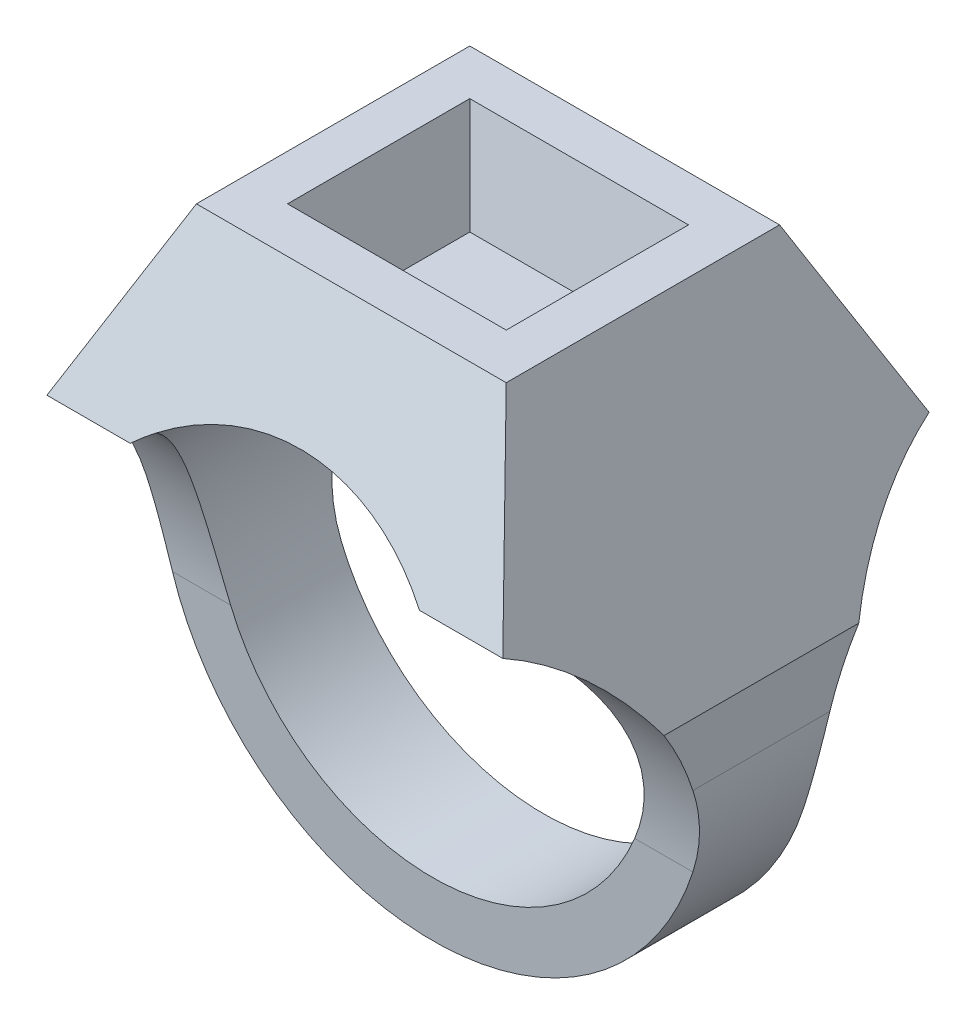
ISO-10303-21;
HEADER;
FILE_DESCRIPTION(('STEP AP214'),'2;1');
FILE_NAME('part.step','',(''),(''),'','','');
FILE_SCHEMA(('AUTOMOTIVE_DESIGN { 1 0 10303 214 1 1 1 1 }'));
ENDSEC;
DATA;
#1=APPLICATION_CONTEXT('core data for automotive mechanical design processes');
#2=APPLICATION_PROTOCOL_DEFINITION('international standard','automotive_design',2000,#1);
#3=PRODUCT_CONTEXT('',#1,'mechanical');
#4=PRODUCT('Part','Part','',(#3));
#5=PRODUCT_RELATED_PRODUCT_CATEGORY('part','',(#4));
#6=PRODUCT_DEFINITION_FORMATION('','',#4);
#7=PRODUCT_DEFINITION_CONTEXT('part definition',#1,'design');
#8=PRODUCT_DEFINITION('design','',#6,#7);
#9=PRODUCT_DEFINITION_SHAPE('','',#8);
#10=(LENGTH_UNIT() NAMED_UNIT(*) SI_UNIT(.MILLI.,.METRE.));
#11=(NAMED_UNIT(*) PLANE_ANGLE_UNIT() SI_UNIT($,.RADIAN.));
#12=(NAMED_UNIT(*) SI_UNIT($,.STERADIAN.) SOLID_ANGLE_UNIT());
#13=UNCERTAINTY_MEASURE_WITH_UNIT(LENGTH_MEASURE(1.E-05),#10,'distance_accuracy_value','');
#14=(GEOMETRIC_REPRESENTATION_CONTEXT(3) GLOBAL_UNCERTAINTY_ASSIGNED_CONTEXT((#13)) GLOBAL_UNIT_ASSIGNED_CONTEXT((#10,
#11,#12)) REPRESENTATION_CONTEXT('',''));
#15=CARTESIAN_POINT('',(0.,0.,0.));
#16=DIRECTION('',(0.,0.,1.));
#17=DIRECTION('',(1.,0.,0.));
#18=AXIS2_PLACEMENT_3D('',#15,#16,#17);
#19=CARTESIAN_POINT('',(0.,0.,25.));
#20=DIRECTION('',(0.,0.,-1.));
#21=DIRECTION('',(-1.,0.,0.));
#22=AXIS2_PLACEMENT_3D('',#19,#20,#21);
#23=CYLINDRICAL_SURFACE('',#22,12.);
#24=CARTESIAN_POINT('',(-7.93725393319378,9.,11.696768923395));
#25=CARTESIAN_POINT('',(-8.04667349740067,8.90351609964056,11.4898922507499));
#26=CARTESIAN_POINT('',(-8.1571220784019,8.80254830553337,11.2856632608987));
#27=CARTESIAN_POINT('',(-8.37896501460795,8.59164106073572,10.8824078082062));
#28=CARTESIAN_POINT('',(-8.49035939595432,8.48170136133743,10.683381489789));
#29=CARTESIAN_POINT('',(-8.71317102583136,8.25265076780511,10.2901048566922));
#30=CARTESIAN_POINT('',(-8.82458797073826,8.13352410114214,10.0958635466891));
#31=CARTESIAN_POINT('',(-9.04626191735329,7.88623633042385,9.71256268223378));
#32=CARTESIAN_POINT('',(-9.15651892820968,7.75807529768293,9.52350308689504));
#33=CARTESIAN_POINT('',(-9.48653155989749,7.35706413653597,8.9601721737352));
#34=CARTESIAN_POINT('',(-9.70312298997916,7.0701129063373,8.5939280432559));
#35=CARTESIAN_POINT('',(-10.1204263028944,6.45863032678024,7.8849565777725));
#36=CARTESIAN_POINT('',(-10.3211516658616,6.13413146905919,7.54220931293983));
#37=CARTESIAN_POINT('',(-10.6392918166008,5.55669457293369,6.98814625535127));
#38=CARTESIAN_POINT('',(-10.7628707384123,5.31390732928114,6.76975468591393));
#39=CARTESIAN_POINT('',(-10.9969580536258,4.81080752831702,6.34647349150372));
#40=CARTESIAN_POINT('',(-11.1074667198264,4.55049533695911,6.14158358476757));
#41=CARTESIAN_POINT('',(-11.3124297164592,4.01386366385305,5.74765796408806));
#42=CARTESIAN_POINT('',(-11.4069466200406,3.73761252408567,5.55856199547818));
#43=CARTESIAN_POINT('',(-11.5777989496208,3.16901263696018,5.19706007980886));
#44=CARTESIAN_POINT('',(-11.6541376380658,2.87666678973379,5.02465114122809));
#45=CARTESIAN_POINT('',(-11.7749227916433,2.32734585475349,4.72562423173207));
#46=CARTESIAN_POINT('',(-11.8225661840739,2.07261645735229,4.5961673635325));
#47=CARTESIAN_POINT('',(-11.9018235106766,1.55413603286752,4.35119713386637));
#48=CARTESIAN_POINT('',(-11.9334405725468,1.29038677683287,4.23568105507132));
#49=CARTESIAN_POINT('',(-11.9792276078791,0.755169507030302,4.01951236535601));
#50=CARTESIAN_POINT('',(-11.9933867417354,0.483696804681923,3.91886902299318));
#51=CARTESIAN_POINT('',(-12.002959676648,-0.0649384365979847,3.73339102333748));
#52=CARTESIAN_POINT('',(-11.9983740023382,-0.342100816069573,3.64855592366956));
#53=CARTESIAN_POINT('',(-11.9693925370385,-0.901349641031121,3.49491881390242));
#54=CARTESIAN_POINT('',(-11.9448963067047,-1.18345393992003,3.42620037475787));
#55=CARTESIAN_POINT('',(-11.8753046240213,-1.74878541220328,3.30563953723561));
#56=CARTESIAN_POINT('',(-11.8302060017873,-2.03201275173859,3.25379973790869));
#57=CARTESIAN_POINT('',(-11.7192518071775,-2.59648992792271,3.16698356966412));
#58=CARTESIAN_POINT('',(-11.6534292828156,-2.87774218918748,3.13198057451761));
#59=CARTESIAN_POINT('',(-11.5011826421243,-3.4360480108004,3.0782259930045));
#60=CARTESIAN_POINT('',(-11.4147714876195,-3.71310409665171,3.05946421607349));
#61=CARTESIAN_POINT('',(-11.282299877384,-4.08919489553573,3.0442092968491));
#62=CARTESIAN_POINT('',(-11.2448453885665,-4.19109177333683,3.04112833424835));
#63=CARTESIAN_POINT('',(-11.1672297899866,-4.3937137718804,3.03704686969025));
#64=CARTESIAN_POINT('',(-11.12707288843,-4.49444044059509,3.03604320696529));
#65=CARTESIAN_POINT('',(-11.0855535003968,-4.59461680554976,3.03604284950542));
#66=B_SPLINE_CURVE_WITH_KNOTS('',3,(#24,#25,#26,#27,#28,#29,#30,#31,#32,#33,#34,#35,#36,#37,#38,
#39,#40,#41,#42,#43,#44,#45,#46,#47,#48,#49,#50,#51,#52,#53,#54,#55,#56,#57,#58,#59,#60,#61,#62,
#63,#64,#65),.UNSPECIFIED.,.F.,.F.,(4,2,2,2,2,2,2,2,2,2,2,2,2,2,2,2,2,2,2,2,4),(0.,
0.759348586630303,1.51871823011696,2.27942192433916,3.04011961448058,4.57765959936899,
6.11387889479053,7.16052804714838,8.20715535029017,9.24958759251021,10.2918326080692,
11.1600331862337,12.028064261107,12.8966340244342,13.7651794782093,14.638133727822,
15.5112223354521,16.3829256376171,17.2540815916275,17.5798547939013,17.9051319423045),.UNSPECIFIED.);
#67=CARTESIAN_POINT('',(-7.93725393319378,9.,11.696768923395));
#68=VERTEX_POINT('',#67);
#69=CARTESIAN_POINT('',(-11.0855535003968,-4.59461680554976,3.03604284950542));
#70=VERTEX_POINT('',#69);
#71=EDGE_CURVE('E291',#68,#70,#66,.T.);
#72=ORIENTED_EDGE('',*,*,#71,.T.);
#73=CARTESIAN_POINT('',(0.,0.,3.03604284950542));
#74=DIRECTION('',(0.,0.,1.));
#75=DIRECTION('',(0.,-1.,0.));
#76=AXIS2_PLACEMENT_3D('',#73,#74,#75);
#77=CIRCLE('',#76,12.);
#78=CARTESIAN_POINT('',(11.0855535003968,-4.59461680554976,3.03604284950542));
#79=VERTEX_POINT('',#78);
#80=EDGE_CURVE('E299',#70,#79,#77,.T.);
#81=ORIENTED_EDGE('',*,*,#80,.T.);
#82=CARTESIAN_POINT('',(11.0855535003968,-4.59461680554976,3.03604284950542));
#83=CARTESIAN_POINT('',(11.138421419146,-4.46706348438094,3.036041789301));
#84=CARTESIAN_POINT('',(11.1890798636254,-4.33861036349681,3.03767035833519));
#85=CARTESIAN_POINT('',(11.2859103847761,-4.08010767040448,3.0443118772741));
#86=CARTESIAN_POINT('',(11.3320823577269,-3.95005806136609,3.04932490540121));
#87=CARTESIAN_POINT('',(11.4637480042315,-3.55787556145179,3.06962580801962));
#88=CARTESIAN_POINT('',(11.542410625838,-3.29366259483693,3.0901754098747));
#89=CARTESIAN_POINT('',(11.6807802152518,-2.76302033783825,3.1459064144027));
#90=CARTESIAN_POINT('',(11.7405624222479,-2.4966043000669,3.1810284158462));
#91=CARTESIAN_POINT('',(11.8415261544587,-1.96266675756447,3.26627957514473));
#92=CARTESIAN_POINT('',(11.8827093197763,-1.69514535240735,3.31640740910512));
#93=CARTESIAN_POINT('',(11.9467472187745,-1.16090106994588,3.43178461738038));
#94=CARTESIAN_POINT('',(11.9695837415583,-0.89417924721384,3.49704893360427));
#95=CARTESIAN_POINT('',(11.9974212423297,-0.363863719348185,3.6424216924295));
#96=CARTESIAN_POINT('',(12.0024209932422,-0.100270230670522,3.72253115589916));
#97=CARTESIAN_POINT('',(11.9954234663236,0.421924236239032,3.89708511165549));
#98=CARTESIAN_POINT('',(11.9834233775811,0.680524381658084,3.99153197231492));
#99=CARTESIAN_POINT('',(11.9434897418651,1.1910601276119,4.19402826172605));
#100=CARTESIAN_POINT('',(11.9155560019593,1.44299564740949,4.30207785517391));
#101=CARTESIAN_POINT('',(11.8442870165842,1.94372608059833,4.53316925707393));
#102=CARTESIAN_POINT('',(11.8006606054012,2.19236262977886,4.65646342508172));
#103=CARTESIAN_POINT('',(11.6995112468579,2.68020578067012,4.91532559810577));
#104=CARTESIAN_POINT('',(11.6419883613321,2.91941242433522,5.0508935485062));
#105=CARTESIAN_POINT('',(11.5144343788272,3.38773319804166,5.33340846483163));
#106=CARTESIAN_POINT('',(11.4443957426687,3.61684114059431,5.4803622589175));
#107=CARTESIAN_POINT('',(11.2932457098966,4.06428255226333,5.78464694060676));
#108=CARTESIAN_POINT('',(11.2121319310931,4.28261368956694,5.94198005696049));
#109=CARTESIAN_POINT('',(10.9941715341438,4.82206411246524,6.35294688322988));
#110=CARTESIAN_POINT('',(10.8507352285186,5.13563863381521,6.6130441774029));
#111=CARTESIAN_POINT('',(10.545723346538,5.73595556999455,7.15291708165343));
#112=CARTESIAN_POINT('',(10.3841387621902,6.02268452926939,7.43270243804255));
#113=CARTESIAN_POINT('',(10.0470217260895,6.56968146369542,8.01023109341833));
#114=CARTESIAN_POINT('',(9.87146562264844,6.82990279194785,8.30800462923527));
#115=CARTESIAN_POINT('',(9.5110291057263,7.32350309212359,8.91942184260404));
#116=CARTESIAN_POINT('',(9.32615173205412,7.55689073451034,9.23306034645478));
#117=CARTESIAN_POINT('',(8.93973325502395,8.01095289546064,9.89536247139068));
#118=CARTESIAN_POINT('',(8.73786895108222,8.22994684789052,10.2449924640223));
#119=CARTESIAN_POINT('',(8.43570141780814,8.53576963673854,10.7810470594009));
#120=CARTESIAN_POINT('',(8.33534063649873,8.63370985870978,10.9611895305723));
#121=CARTESIAN_POINT('',(8.13545803656732,8.82231463455355,11.3257512458851));
#122=CARTESIAN_POINT('',(8.03593637916446,8.91297781758098,11.5101712874384));
#123=CARTESIAN_POINT('',(7.93725393319378,9.,11.696768923395));
#124=B_SPLINE_CURVE_WITH_KNOTS('',3,(#82,#83,#84,#85,#86,#87,#88,#89,#90,#91,#92,#93,#94,#95,
#96,#97,#98,#99,#100,#101,#102,#103,#104,#105,#106,#107,#108,#109,#110,#111,#112,#113,#114,#115,
#116,#117,#118,#119,#120,#121,#122,#123),.UNSPECIFIED.,.F.,.F.,(4,2,2,2,2,2,2,2,2,2,2,2,2,2,2,2,
2,2,2,2,4),(0.,0.414165407508414,0.828340387630297,1.65654016329892,2.48139662267758,
3.3061803302539,4.13178171100707,4.95743988764456,5.78323460221001,6.60903931611264,
7.45103137420718,8.29301968579328,9.13551691064011,9.97819563737871,11.2719945577453,
12.5664385238796,13.8631224082928,15.1593861254669,16.5358690414418,17.2206028657483,
17.9054653786171),.UNSPECIFIED.);
#125=CARTESIAN_POINT('',(7.93725393319377,9.,11.696768923395));
#126=VERTEX_POINT('',#125);
#127=EDGE_CURVE('E282',#79,#126,#124,.T.);
#128=ORIENTED_EDGE('',*,*,#127,.T.);
#129=CARTESIAN_POINT('',(0.,0.,15.8935378467899));
#130=DIRECTION('',(0.,0.422618261740697,0.906307787036651));
#131=DIRECTION('',(0.,0.906307787036651,-0.422618261740697));
#132=AXIS2_PLACEMENT_3D('',#129,#130,#131);
#133=ELLIPSE('',#132,13.2405350275499,12.);
#134=EDGE_CURVE('E383',#126,#68,#133,.T.);
#135=ORIENTED_EDGE('',*,*,#134,.T.);
#136=EDGE_LOOP('',(#72,#81,#128,#135));
#137=FACE_BOUND('',#136,.T.);
#138=CARTESIAN_POINT('',(-11.0855535003968,-4.59461680554976,-3.03604284950542));
#139=CARTESIAN_POINT('',(-11.138421419146,-4.46706348438094,-3.036041789301));
#140=CARTESIAN_POINT('',(-11.1890798636254,-4.33861036349681,-3.03767035833519));
#141=CARTESIAN_POINT('',(-11.2859103847761,-4.08010767040448,-3.0443118772741));
#142=CARTESIAN_POINT('',(-11.3320823577269,-3.95005806136609,-3.04932490540121));
#143=CARTESIAN_POINT('',(-11.4637480042315,-3.55787556145178,-3.06962580801962));
#144=CARTESIAN_POINT('',(-11.542410625838,-3.29366259483693,-3.0901754098747));
#145=CARTESIAN_POINT('',(-11.6807802152518,-2.76302033783825,-3.1459064144027));
#146=CARTESIAN_POINT('',(-11.7405624222479,-2.49660430006689,-3.1810284158462));
#147=CARTESIAN_POINT('',(-11.8415261544587,-1.96266675756447,-3.26627957514473));
#148=CARTESIAN_POINT('',(-11.8827093197763,-1.69514535240735,-3.31640740910512));
#149=CARTESIAN_POINT('',(-11.9467472187745,-1.16090106994587,-3.43178461738038));
#150=CARTESIAN_POINT('',(-11.9695837415583,-0.894179247213835,-3.49704893360427));
#151=CARTESIAN_POINT('',(-11.9974212423297,-0.363863719348179,-3.6424216924295));
#152=CARTESIAN_POINT('',(-12.0024209932422,-0.100270230670517,-3.72253115589915));
#153=CARTESIAN_POINT('',(-11.9954234663236,0.421924236239038,-3.89708511165548));
#154=CARTESIAN_POINT('',(-11.9834233775811,0.68052438165809,-3.99153197231492));
#155=CARTESIAN_POINT('',(-11.9434897418651,1.19106012761191,-4.19402826172605));
#156=CARTESIAN_POINT('',(-11.9155560019593,1.44299564740949,-4.30207785517391));
#157=CARTESIAN_POINT('',(-11.8442870165842,1.94372608059834,-4.53316925707393));
#158=CARTESIAN_POINT('',(-11.8006606054012,2.19236262977887,-4.65646342508172));
#159=CARTESIAN_POINT('',(-11.6995112468579,2.68020578067013,-4.91532559810577));
#160=CARTESIAN_POINT('',(-11.6419883613321,2.91941242433522,-5.0508935485062));
#161=CARTESIAN_POINT('',(-11.5144343788272,3.38773319804166,-5.33340846483163));
#162=CARTESIAN_POINT('',(-11.4443957426687,3.61684114059431,-5.4803622589175));
#163=CARTESIAN_POINT('',(-11.2932457098966,4.06428255226334,-5.78464694060675));
#164=CARTESIAN_POINT('',(-11.2121319310931,4.28261368956694,-5.94198005696048));
#165=CARTESIAN_POINT('',(-10.9941715341438,4.82206411246525,-6.35294688322988));
#166=CARTESIAN_POINT('',(-10.8507352285186,5.13563863381522,-6.61304417740289));
#167=CARTESIAN_POINT('',(-10.545723346538,5.73595556999455,-7.15291708165342));
#168=CARTESIAN_POINT('',(-10.3841387621902,6.0226845292694,-7.43270243804255));
#169=CARTESIAN_POINT('',(-10.0470217260895,6.56968146369542,-8.01023109341833));
#170=CARTESIAN_POINT('',(-9.87146562264844,6.82990279194785,-8.30800462923527));
#171=CARTESIAN_POINT('',(-9.5110291057263,7.3235030921236,-8.91942184260403));
#172=CARTESIAN_POINT('',(-9.32615173205412,7.55689073451035,-9.23306034645478));
#173=CARTESIAN_POINT('',(-8.93973325502395,8.01095289546065,-9.89536247139068));
#174=CARTESIAN_POINT('',(-8.73786895108222,8.22994684789052,-10.2449924640223));
#175=CARTESIAN_POINT('',(-8.43570141780814,8.53576963673854,-10.7810470594009));
#176=CARTESIAN_POINT('',(-8.33534063649873,8.63370985870978,-10.9611895305723));
#177=CARTESIAN_POINT('',(-8.13545803656732,8.82231463455356,-11.3257512458851));
#178=CARTESIAN_POINT('',(-8.03593637916446,8.91297781758098,-11.5101712874384));
#179=CARTESIAN_POINT('',(-7.93725393319377,9.,-11.696768923395));
#180=B_SPLINE_CURVE_WITH_KNOTS('',3,(#138,#139,#140,#141,#142,#143,#144,#145,#146,#147,#148,
#149,#150,#151,#152,#153,#154,#155,#156,#157,#158,#159,#160,#161,#162,#163,#164,#165,#166,#167,
#168,#169,#170,#171,#172,#173,#174,#175,#176,#177,#178,#179),.UNSPECIFIED.,.F.,.F.,(4,2,2,2,2,2,
2,2,2,2,2,2,2,2,2,2,2,2,2,2,4),(0.,0.414165407508414,0.828340387630296,1.65654016329892,
2.48139662267758,3.3061803302539,4.13178171100707,4.95743988764456,5.78323460221001,
6.60903931611264,7.45103137420718,8.29301968579328,9.13551691064011,9.97819563737871,
11.2719945577453,12.5664385238796,13.8631224082928,15.1593861254669,16.5358690414418,
17.2206028657483,17.9054653786171),.UNSPECIFIED.);
#181=CARTESIAN_POINT('',(-11.0855535003968,-4.59461680554976,-3.03604284950542));
#182=VERTEX_POINT('',#181);
#183=CARTESIAN_POINT('',(-7.93725393319377,9.00000000000001,-11.696768923395));
#184=VERTEX_POINT('',#183);
#185=EDGE_CURVE('E56',#182,#184,#180,.T.);
#186=ORIENTED_EDGE('',*,*,#185,.T.);
#187=CARTESIAN_POINT('',(0.,0.,-15.8935378467899));
#188=DIRECTION('',(0.,0.422618261740697,-0.906307787036651));
#189=DIRECTION('',(0.,-0.906307787036651,-0.422618261740697));
#190=AXIS2_PLACEMENT_3D('',#187,#188,#189);
#191=ELLIPSE('',#190,13.2405350275499,12.);
#192=CARTESIAN_POINT('',(7.93725393319377,9.00000000000001,-11.696768923395));
#193=VERTEX_POINT('',#192);
#194=EDGE_CURVE('E12',#184,#193,#191,.T.);
#195=ORIENTED_EDGE('',*,*,#194,.T.);
#196=CARTESIAN_POINT('',(7.93725393319377,9.,-11.696768923395));
#197=CARTESIAN_POINT('',(8.04667349740066,8.90351609964056,-11.4898922507499));
#198=CARTESIAN_POINT('',(8.15712207840189,8.80254830553338,-11.2856632608987));
#199=CARTESIAN_POINT('',(8.37896501460795,8.59164106073572,-10.8824078082062));
#200=CARTESIAN_POINT('',(8.49035939595432,8.48170136133743,-10.683381489789));
#201=CARTESIAN_POINT('',(8.71317102583136,8.25265076780511,-10.2901048566922));
#202=CARTESIAN_POINT('',(8.82458797073825,8.13352410114215,-10.0958635466891));
#203=CARTESIAN_POINT('',(9.04626191735329,7.88623633042385,-9.71256268223377));
#204=CARTESIAN_POINT('',(9.15651892820967,7.75807529768293,-9.52350308689503));
#205=CARTESIAN_POINT('',(9.48653155989749,7.35706413653597,-8.9601721737352));
#206=CARTESIAN_POINT('',(9.70312298997915,7.07011290633731,-8.5939280432559));
#207=CARTESIAN_POINT('',(10.1204263028944,6.45863032678025,-7.8849565777725));
#208=CARTESIAN_POINT('',(10.3211516658616,6.13413146905919,-7.54220931293983));
#209=CARTESIAN_POINT('',(10.6392918166008,5.55669457293369,-6.98814625535127));
#210=CARTESIAN_POINT('',(10.7628707384123,5.31390732928115,-6.76975468591393));
#211=CARTESIAN_POINT('',(10.9969580536258,4.81080752831703,-6.34647349150372));
#212=CARTESIAN_POINT('',(11.1074667198264,4.55049533695912,-6.14158358476757));
#213=CARTESIAN_POINT('',(11.3124297164592,4.01386366385306,-5.74765796408806));
#214=CARTESIAN_POINT('',(11.4069466200406,3.73761252408567,-5.55856199547818));
#215=CARTESIAN_POINT('',(11.5777989496208,3.16901263696019,-5.19706007980886));
#216=CARTESIAN_POINT('',(11.6541376380658,2.8766667897338,-5.02465114122809));
#217=CARTESIAN_POINT('',(11.7749227916433,2.32734585475349,-4.72562423173207));
#218=CARTESIAN_POINT('',(11.8225661840739,2.07261645735229,-4.5961673635325));
#219=CARTESIAN_POINT('',(11.9018235106766,1.55413603286752,-4.35119713386637));
#220=CARTESIAN_POINT('',(11.9334405725468,1.29038677683287,-4.23568105507132));
#221=CARTESIAN_POINT('',(11.9792276078791,0.755169507030305,-4.01951236535601));
#222=CARTESIAN_POINT('',(11.9933867417354,0.483696804681925,-3.91886902299318));
#223=CARTESIAN_POINT('',(12.002959676648,-0.0649384365979826,-3.73339102333747));
#224=CARTESIAN_POINT('',(11.9983740023382,-0.34210081606957,-3.64855592366956));
#225=CARTESIAN_POINT('',(11.9693925370385,-0.901349641031118,-3.49491881390242));
#226=CARTESIAN_POINT('',(11.9448963067047,-1.18345393992003,-3.42620037475787));
#227=CARTESIAN_POINT('',(11.8753046240213,-1.74878541220328,-3.30563953723561));
#228=CARTESIAN_POINT('',(11.8302060017873,-2.03201275173859,-3.25379973790868));
#229=CARTESIAN_POINT('',(11.7192518071775,-2.59648992792271,-3.16698356966412));
#230=CARTESIAN_POINT('',(11.6534292828156,-2.87774218918748,-3.1319805745176));
#231=CARTESIAN_POINT('',(11.5011826421243,-3.4360480108004,-3.0782259930045));
#232=CARTESIAN_POINT('',(11.4147714876195,-3.71310409665171,-3.05946421607349));
#233=CARTESIAN_POINT('',(11.282299877384,-4.08919489553573,-3.04420929684909));
#234=CARTESIAN_POINT('',(11.2448453885665,-4.19109177333683,-3.04112833424835));
#235=CARTESIAN_POINT('',(11.1672297899866,-4.3937137718804,-3.03704686969024));
#236=CARTESIAN_POINT('',(11.12707288843,-4.49444044059509,-3.03604320696529));
#237=CARTESIAN_POINT('',(11.0855535003968,-4.59461680554976,-3.03604284950542));
#238=B_SPLINE_CURVE_WITH_KNOTS('',3,(#196,#197,#198,#199,#200,#201,#202,#203,#204,#205,#206,
#207,#208,#209,#210,#211,#212,#213,#214,#215,#216,#217,#218,#219,#220,#221,#222,#223,#224,#225,
#226,#227,#228,#229,#230,#231,#232,#233,#234,#235,#236,#237),.UNSPECIFIED.,.F.,.F.,(4,2,2,2,2,2,
2,2,2,2,2,2,2,2,2,2,2,2,2,2,4),(0.,0.759348586630303,1.51871823011696,2.27942192433916,
3.04011961448058,4.57765959936899,6.11387889479053,7.16052804714838,8.20715535029017,
9.24958759251021,10.2918326080692,11.1600331862337,12.028064261107,12.8966340244342,
13.7651794782093,14.638133727822,15.5112223354521,16.3829256376171,17.2540815916275,
17.5798547939013,17.9051319423045),.UNSPECIFIED.);
#239=CARTESIAN_POINT('',(11.0855535003968,-4.59461680554976,-3.03604284950542));
#240=VERTEX_POINT('',#239);
#241=EDGE_CURVE('E312',#193,#240,#238,.T.);
#242=ORIENTED_EDGE('',*,*,#241,.T.);
#243=CARTESIAN_POINT('',(0.,0.,-3.03604284950542));
#244=DIRECTION('',(0.,0.,-1.));
#245=DIRECTION('',(-1.,0.,0.));
#246=AXIS2_PLACEMENT_3D('',#243,#244,#245);
#247=CIRCLE('',#246,12.);
#248=EDGE_CURVE('E320',#240,#182,#247,.T.);
#249=ORIENTED_EDGE('',*,*,#248,.T.);
#250=EDGE_LOOP('',(#186,#195,#242,#249));
#251=FACE_BOUND('',#250,.T.);
#252=ADVANCED_FACE('F46',(#137,#251),#23,.F.);
#253=CARTESIAN_POINT('',(-15.,18.,7.5));
#254=DIRECTION('',(0.,0.422618261740697,0.906307787036651));
#255=DIRECTION('',(0.,-0.906307787036651,0.422618261740697));
#256=AXIS2_PLACEMENT_3D('',#253,#254,#255);
#257=PLANE('',#256);
#258=DIRECTION('',(-0.374198382619726,0.840463328099389,-0.39191448629118));
#259=VECTOR('',#258,1.);
#260=CARTESIAN_POINT('',(11.0664409206695,12.2356793141237,10.1879468798854));
#261=LINE('',#260,#259);
#262=CARTESIAN_POINT('',(12.5070581677768,9.,11.696768923395));
#263=VERTEX_POINT('',#262);
#264=CARTESIAN_POINT('',(8.49999999999999,18.,7.5));
#265=VERTEX_POINT('',#264);
#266=EDGE_CURVE('E247',#263,#265,#261,.T.);
#267=ORIENTED_EDGE('',*,*,#266,.T.);
#268=DIRECTION('',(1.,0.,0.));
#269=VECTOR('',#268,1.);
#270=CARTESIAN_POINT('',(-15.,18.,7.5));
#271=LINE('',#270,#269);
#272=CARTESIAN_POINT('',(-8.5,18.,7.5));
#273=VERTEX_POINT('',#272);
#274=EDGE_CURVE('E238',#273,#265,#271,.T.);
#275=ORIENTED_EDGE('',*,*,#274,.F.);
#276=DIRECTION('',(-0.374198382619726,-0.840463328099389,0.39191448629118));
#277=VECTOR('',#276,1.);
#278=CARTESIAN_POINT('',(-11.0664409206695,12.2356793141237,10.1879468798854));
#279=LINE('',#278,#277);
#280=CARTESIAN_POINT('',(-12.5070581677768,9.,11.696768923395));
#281=VERTEX_POINT('',#280);
#282=EDGE_CURVE('E244',#273,#281,#279,.T.);
#283=ORIENTED_EDGE('',*,*,#282,.T.);
#284=DIRECTION('',(1.,0.,0.));
#285=VECTOR('',#284,1.);
#286=CARTESIAN_POINT('',(-15.,9.,11.696768923395));
#287=LINE('',#286,#285);
#288=EDGE_CURVE('E233',#281,#68,#287,.T.);
#289=ORIENTED_EDGE('',*,*,#288,.T.);
#290=ORIENTED_EDGE('',*,*,#134,.F.);
#291=EDGE_CURVE('E234',#126,#263,#287,.T.);
#292=ORIENTED_EDGE('',*,*,#291,.T.);
#293=EDGE_LOOP('',(#267,#275,#283,#289,#290,#292));
#294=FACE_BOUND('',#293,.T.);
#295=ADVANCED_FACE('F277',(#294),#257,.T.);
#296=CARTESIAN_POINT('',(-15.,-4.59461680554976,18.0360428495054));
#297=DIRECTION('',(1.,0.,0.));
#298=DIRECTION('',(0.,0.,-1.));
#299=AXIS2_PLACEMENT_3D('',#296,#297,#298);
#300=CYLINDRICAL_SURFACE('',#299,15.);
#301=CARTESIAN_POINT('',(14.2789879336793,-4.59461680554976,3.03604284950542));
#302=CARTESIAN_POINT('',(14.326177497456,-4.4479669360984,3.03604174430346));
#303=CARTESIAN_POINT('',(14.3710995785961,-4.30060517460594,3.03819413908523));
#304=CARTESIAN_POINT('',(14.4563557749919,-4.00468337167546,3.04691703559563));
#305=CARTESIAN_POINT('',(14.496689683426,-3.85612327654299,3.05348773639663));
#306=CARTESIAN_POINT('',(14.610744372321,-3.40892213038199,3.07999852624463));
#307=CARTESIAN_POINT('',(14.6774922229488,-3.10884075160678,3.10673742556649));
#308=CARTESIAN_POINT('',(14.7910817825412,-2.51282936192041,3.17822825431666));
#309=CARTESIAN_POINT('',(14.8382626947712,-2.21692281677853,3.22264455282002));
#310=CARTESIAN_POINT('',(14.914556348028,-1.62622161215798,3.32962863738144));
#311=CARTESIAN_POINT('',(14.9436806217174,-1.33142636274987,3.3921848000658));
#312=CARTESIAN_POINT('',(14.9760969969822,-0.864278725422214,3.50618757383235));
#313=CARTESIAN_POINT('',(14.9850771650365,-0.690857738142005,3.55181607938055));
#314=CARTESIAN_POINT('',(14.9970471626202,-0.344623763339655,3.64958677784154));
#315=CARTESIAN_POINT('',(15.0000038763037,-0.171819323434259,3.70176331439495));
#316=CARTESIAN_POINT('',(15.,0.,3.7570549158261));
#317=B_SPLINE_CURVE_WITH_KNOTS('',3,(#301,#302,#303,#304,#305,#306,#307,#308,#309,#310,#311,
#312,#313,#314,#315,#316),.UNSPECIFIED.,.F.,.F.,(4,2,2,2,2,2,2,4),(0.,0.462097096824935,
0.924215015413381,1.84870381350426,2.75641869003593,3.66355321586226,4.20200107272341,
4.7434013140187),.UNSPECIFIED.);
#318=CARTESIAN_POINT('',(14.2789879336793,-4.59461680554976,3.03604284950542));
#319=VERTEX_POINT('',#318);
#320=CARTESIAN_POINT('',(15.,0.,3.7570549158261));
#321=VERTEX_POINT('',#320);
#322=EDGE_CURVE('E255',#319,#321,#317,.T.);
#323=ORIENTED_EDGE('',*,*,#322,.T.);
#324=CARTESIAN_POINT('',(15.,-4.59461680554976,18.0360428495054));
#325=DIRECTION('',(-1.,0.,0.));
#326=DIRECTION('',(0.,0.,1.));
#327=AXIS2_PLACEMENT_3D('',#324,#325,#326);
#328=CIRCLE('',#327,15.);
#329=CARTESIAN_POINT('',(15.,3.4007609696225,5.34455222656119));
#330=VERTEX_POINT('',#329);
#331=EDGE_CURVE('E200',#330,#321,#328,.T.);
#332=ORIENTED_EDGE('',*,*,#331,.F.);
#333=CARTESIAN_POINT('',(18.559771535385,-4.59461680554976,18.0360428495054));
#334=DIRECTION('',(-0.913545457642602,-0.406736643075798,0.));
#335=DIRECTION('',(0.406736643075798,-0.913545457642602,0.));
#336=AXIS2_PLACEMENT_3D('',#333,#334,#335);
#337=ELLIPSE('',#336,16.4195441775907,15.);
#338=EDGE_CURVE('E252',#330,#263,#337,.F.);
#339=ORIENTED_EDGE('',*,*,#338,.T.);
#340=ORIENTED_EDGE('',*,*,#291,.F.);
#341=ORIENTED_EDGE('',*,*,#127,.F.);
#342=DIRECTION('',(1.,0.,0.));
#343=VECTOR('',#342,1.);
#344=CARTESIAN_POINT('',(-15.,-4.59461680554976,3.03604284950542));
#345=LINE('',#344,#343);
#346=EDGE_CURVE('E229',#79,#319,#345,.T.);
#347=ORIENTED_EDGE('',*,*,#346,.T.);
#348=EDGE_LOOP('',(#323,#332,#339,#340,#341,#347));
#349=FACE_BOUND('',#348,.T.);
#350=ADVANCED_FACE('F275',(#349),#300,.F.);
#351=CARTESIAN_POINT('',(-15.,0.,3.75705491582609));
#352=CARTESIAN_POINT('',(-15.000001105202,-0.14664986945137,3.70986535204939));
#353=CARTESIAN_POINT('',(-14.9978487104202,-0.294011630943826,3.66494327090935));
#354=CARTESIAN_POINT('',(-14.9891258139098,-0.58993343387431,3.57968707451354));
#355=CARTESIAN_POINT('',(-14.9825551131088,-0.738493529006777,3.53935316607945));
#356=CARTESIAN_POINT('',(-14.9560443232608,-1.18569467516778,3.42529847718444));
#357=CARTESIAN_POINT('',(-14.9293054239389,-1.48577605394299,3.35855062655662));
#358=CARTESIAN_POINT('',(-14.8578145951888,-2.08178744362935,3.2449610669642));
#359=CARTESIAN_POINT('',(-14.8133982966854,-2.37769398877123,3.19778015473421));
#360=CARTESIAN_POINT('',(-14.706414212124,-2.96839519339179,3.12148650147743));
#361=CARTESIAN_POINT('',(-14.6438580494396,-3.26319044279989,3.092362227788));
#362=CARTESIAN_POINT('',(-14.5298552756731,-3.73033808012755,3.05994585252327));
#363=CARTESIAN_POINT('',(-14.4842267701249,-3.90375906740776,3.05096568446892));
#364=CARTESIAN_POINT('',(-14.3864560716639,-4.24999304221011,3.03899568688527));
#365=CARTESIAN_POINT('',(-14.3342795351105,-4.4227974821155,3.03603897320174));
#366=CARTESIAN_POINT('',(-14.2789879336793,-4.59461680554976,3.03604284950543));
#367=B_SPLINE_CURVE_WITH_KNOTS('',3,(#351,#352,#353,#354,#355,#356,#357,#358,#359,#360,#361,
#362,#363,#364,#365,#366),.UNSPECIFIED.,.F.,.F.,(4,2,2,2,2,2,2,4),(0.,0.462097096824935,
0.924215015413381,1.84870381350425,2.75641869003593,3.66355321586226,4.20200107272341,
4.7434013140187),.UNSPECIFIED.);
#368=CARTESIAN_POINT('',(-15.,0.,3.7570549158261));
#369=VERTEX_POINT('',#368);
#370=CARTESIAN_POINT('',(-14.2789879336793,-4.59461680554976,3.03604284950542));
#371=VERTEX_POINT('',#370);
#372=EDGE_CURVE('E263',#369,#371,#367,.T.);
#373=ORIENTED_EDGE('',*,*,#372,.T.);
#374=EDGE_CURVE('E228',#371,#70,#345,.T.);
#375=ORIENTED_EDGE('',*,*,#374,.T.);
#376=ORIENTED_EDGE('',*,*,#71,.F.);
#377=ORIENTED_EDGE('',*,*,#288,.F.);
#378=CARTESIAN_POINT('',(-18.559771535385,-4.59461680554976,18.0360428495054));
#379=DIRECTION('',(0.913545457642602,-0.406736643075798,0.));
#380=DIRECTION('',(0.406736643075798,0.913545457642602,0.));
#381=AXIS2_PLACEMENT_3D('',#378,#379,#380);
#382=ELLIPSE('',#381,16.4195441775907,15.);
#383=CARTESIAN_POINT('',(-15.,3.40076096962251,5.34455222656119));
#384=VERTEX_POINT('',#383);
#385=EDGE_CURVE('E71',#281,#384,#382,.F.);
#386=ORIENTED_EDGE('',*,*,#385,.T.);
#387=CARTESIAN_POINT('',(-15.,-4.59461680554976,18.0360428495054));
#388=DIRECTION('',(-1.,0.,0.));
#389=DIRECTION('',(0.,0.,1.));
#390=AXIS2_PLACEMENT_3D('',#387,#388,#389);
#391=CIRCLE('',#390,15.);
#392=EDGE_CURVE('E211',#384,#369,#391,.T.);
#393=ORIENTED_EDGE('',*,*,#392,.T.);
#394=EDGE_LOOP('',(#373,#375,#376,#377,#386,#393));
#395=FACE_BOUND('',#394,.T.);
#396=ADVANCED_FACE('F269',(#395),#300,.F.);
#397=CARTESIAN_POINT('',(-15.,-4.59461680554976,3.03604284950542));
#398=DIRECTION('',(0.,0.,1.));
#399=DIRECTION('',(0.,-1.,0.));
#400=AXIS2_PLACEMENT_3D('',#397,#398,#399);
#401=PLANE('',#400);
#402=CARTESIAN_POINT('',(0.,0.,3.03604284950542));
#403=DIRECTION('',(0.,0.,1.));
#404=DIRECTION('',(0.,-1.,0.));
#405=AXIS2_PLACEMENT_3D('',#402,#403,#404);
#406=CIRCLE('',#405,15.);
#407=EDGE_CURVE('E397',#371,#319,#406,.T.);
#408=ORIENTED_EDGE('',*,*,#407,.T.);
#409=ORIENTED_EDGE('',*,*,#346,.F.);
#410=ORIENTED_EDGE('',*,*,#80,.F.);
#411=ORIENTED_EDGE('',*,*,#374,.F.);
#412=EDGE_LOOP('',(#408,#409,#410,#411));
#413=FACE_BOUND('',#412,.T.);
#414=ADVANCED_FACE('F274',(#413),#401,.T.);
#415=CARTESIAN_POINT('',(-15.,18.,-7.5));
#416=DIRECTION('',(0.,0.422618261740697,-0.906307787036651));
#417=DIRECTION('',(0.,0.906307787036651,0.422618261740697));
#418=AXIS2_PLACEMENT_3D('',#415,#416,#417);
#419=PLANE('',#418);
#420=DIRECTION('',(0.374198382619726,-0.840463328099389,-0.39191448629118));
#421=VECTOR('',#420,1.);
#422=CARTESIAN_POINT('',(3.73375257589949,28.705166988056,-2.50809865164141));
#423=LINE('',#422,#421);
#424=CARTESIAN_POINT('',(8.49999999999999,18.,-7.5));
#425=VERTEX_POINT('',#424);
#426=CARTESIAN_POINT('',(12.5070581677768,9.00000000000001,-11.696768923395));
#427=VERTEX_POINT('',#426);
#428=EDGE_CURVE('E357',#425,#427,#423,.T.);
#429=ORIENTED_EDGE('',*,*,#428,.T.);
#430=DIRECTION('',(1.,0.,0.));
#431=VECTOR('',#430,1.);
#432=CARTESIAN_POINT('',(-15.,9.00000000000001,-11.696768923395));
#433=LINE('',#432,#431);
#434=EDGE_CURVE('E218',#193,#427,#433,.T.);
#435=ORIENTED_EDGE('',*,*,#434,.F.);
#436=ORIENTED_EDGE('',*,*,#194,.F.);
#437=CARTESIAN_POINT('',(-12.5070581677768,9.00000000000001,-11.696768923395));
#438=VERTEX_POINT('',#437);
#439=EDGE_CURVE('E222',#438,#184,#433,.T.);
#440=ORIENTED_EDGE('',*,*,#439,.F.);
#441=DIRECTION('',(0.374198382619726,0.840463328099389,0.39191448629118));
#442=VECTOR('',#441,1.);
#443=CARTESIAN_POINT('',(-3.73375257589949,28.705166988056,-2.50809865164141));
#444=LINE('',#443,#442);
#445=CARTESIAN_POINT('',(-8.5,18.,-7.5));
#446=VERTEX_POINT('',#445);
#447=EDGE_CURVE('E354',#438,#446,#444,.T.);
#448=ORIENTED_EDGE('',*,*,#447,.T.);
#449=DIRECTION('',(1.,0.,0.));
#450=VECTOR('',#449,1.);
#451=CARTESIAN_POINT('',(-15.,18.,-7.5));
#452=LINE('',#451,#450);
#453=EDGE_CURVE('E217',#446,#425,#452,.T.);
#454=ORIENTED_EDGE('',*,*,#453,.T.);
#455=EDGE_LOOP('',(#429,#435,#436,#440,#448,#454));
#456=FACE_BOUND('',#455,.T.);
#457=ADVANCED_FACE('F305',(#456),#419,.T.);
#458=CARTESIAN_POINT('',(-15.,-4.59461680554976,-18.0360428495054));
#459=DIRECTION('',(1.,0.,0.));
#460=DIRECTION('',(0.,0.,-1.));
#461=AXIS2_PLACEMENT_3D('',#458,#459,#460);
#462=CYLINDRICAL_SURFACE('',#461,15.);
#463=CARTESIAN_POINT('',(15.,0.,-3.7570549158261));
#464=CARTESIAN_POINT('',(15.000001105202,-0.146649869451366,-3.70986535204939));
#465=CARTESIAN_POINT('',(14.9978487104202,-0.294011630943822,-3.66494327090934));
#466=CARTESIAN_POINT('',(14.9891258139098,-0.589933433874306,-3.57968707451354));
#467=CARTESIAN_POINT('',(14.9825551131088,-0.738493529006773,-3.53935316607944));
#468=CARTESIAN_POINT('',(14.9560443232608,-1.18569467516777,-3.42529847718444));
#469=CARTESIAN_POINT('',(14.9293054239389,-1.48577605394298,-3.35855062655661));
#470=CARTESIAN_POINT('',(14.8578145951888,-2.08178744362935,-3.2449610669642));
#471=CARTESIAN_POINT('',(14.8133982966854,-2.37769398877123,-3.1977801547342));
#472=CARTESIAN_POINT('',(14.706414212124,-2.96839519339179,-3.12148650147743));
#473=CARTESIAN_POINT('',(14.6438580494396,-3.26319044279989,-3.09236222778799));
#474=CARTESIAN_POINT('',(14.5298552756731,-3.73033808012755,-3.05994585252327));
#475=CARTESIAN_POINT('',(14.4842267701249,-3.90375906740775,-3.05096568446892));
#476=CARTESIAN_POINT('',(14.3864560716639,-4.2499930422101,-3.03899568688527));
#477=CARTESIAN_POINT('',(14.3342795351105,-4.4227974821155,-3.03603897320173));
#478=CARTESIAN_POINT('',(14.2789879336793,-4.59461680554976,-3.03604284950542));
#479=B_SPLINE_CURVE_WITH_KNOTS('',3,(#463,#464,#465,#466,#467,#468,#469,#470,#471,#472,#473,
#474,#475,#476,#477,#478),.UNSPECIFIED.,.F.,.F.,(4,2,2,2,2,2,2,4),(0.,0.462097096824936,
0.924215015413382,1.84870381350426,2.75641869003593,3.66355321586226,4.20200107272341,
4.7434013140187),.UNSPECIFIED.);
#480=CARTESIAN_POINT('',(15.,0.,-3.7570549158261));
#481=VERTEX_POINT('',#480);
#482=CARTESIAN_POINT('',(14.2789879336793,-4.59461680554976,-3.03604284950542));
#483=VERTEX_POINT('',#482);
#484=EDGE_CURVE('E345',#481,#483,#479,.T.);
#485=ORIENTED_EDGE('',*,*,#484,.T.);
#486=DIRECTION('',(1.,0.,0.));
#487=VECTOR('',#486,1.);
#488=CARTESIAN_POINT('',(-15.,-4.59461680554976,-3.03604284950542));
#489=LINE('',#488,#487);
#490=EDGE_CURVE('E224',#240,#483,#489,.T.);
#491=ORIENTED_EDGE('',*,*,#490,.F.);
#492=ORIENTED_EDGE('',*,*,#241,.F.);
#493=ORIENTED_EDGE('',*,*,#434,.T.);
#494=CARTESIAN_POINT('',(18.559771535385,-4.59461680554976,-18.0360428495054));
#495=DIRECTION('',(-0.913545457642602,-0.406736643075798,0.));
#496=DIRECTION('',(0.406736643075798,-0.913545457642602,0.));
#497=AXIS2_PLACEMENT_3D('',#494,#495,#496);
#498=ELLIPSE('',#497,16.4195441775907,15.);
#499=CARTESIAN_POINT('',(15.,3.4007609696225,-5.34455222656119));
#500=VERTEX_POINT('',#499);
#501=EDGE_CURVE('E346',#427,#500,#498,.F.);
#502=ORIENTED_EDGE('',*,*,#501,.T.);
#503=CARTESIAN_POINT('',(15.,-4.59461680554976,-18.0360428495054));
#504=DIRECTION('',(-1.,0.,0.));
#505=DIRECTION('',(0.,0.,-1.));
#506=AXIS2_PLACEMENT_3D('',#503,#504,#505);
#507=CIRCLE('',#506,15.);
#508=EDGE_CURVE('E204',#481,#500,#507,.T.);
#509=ORIENTED_EDGE('',*,*,#508,.F.);
#510=EDGE_LOOP('',(#485,#491,#492,#493,#502,#509));
#511=FACE_BOUND('',#510,.T.);
#512=ADVANCED_FACE('F325',(#511),#462,.F.);
#513=CARTESIAN_POINT('',(-14.2789879336793,-4.59461680554976,-3.03604284950542));
#514=CARTESIAN_POINT('',(-14.326177497456,-4.44796693609839,-3.03604174430346));
#515=CARTESIAN_POINT('',(-14.3710995785961,-4.30060517460594,-3.03819413908522));
#516=CARTESIAN_POINT('',(-14.4563557749919,-4.00468337167545,-3.04691703559563));
#517=CARTESIAN_POINT('',(-14.496689683426,-3.85612327654298,-3.05348773639663));
#518=CARTESIAN_POINT('',(-14.610744372321,-3.40892213038199,-3.07999852624463));
#519=CARTESIAN_POINT('',(-14.6774922229488,-3.10884075160677,-3.10673742556648));
#520=CARTESIAN_POINT('',(-14.7910817825412,-2.51282936192041,-3.17822825431666));
#521=CARTESIAN_POINT('',(-14.8382626947712,-2.21692281677853,-3.22264455282001));
#522=CARTESIAN_POINT('',(-14.914556348028,-1.62622161215797,-3.32962863738144));
#523=CARTESIAN_POINT('',(-14.9436806217174,-1.33142636274986,-3.3921848000658));
#524=CARTESIAN_POINT('',(-14.9760969969822,-0.864278725422212,-3.50618757383235));
#525=CARTESIAN_POINT('',(-14.9850771650365,-0.690857738142003,-3.55181607938055));
#526=CARTESIAN_POINT('',(-14.9970471626202,-0.344623763339654,-3.64958677784154));
#527=CARTESIAN_POINT('',(-15.0000038763037,-0.171819323434259,-3.70176331439495));
#528=CARTESIAN_POINT('',(-15.,0.,-3.7570549158261));
#529=B_SPLINE_CURVE_WITH_KNOTS('',3,(#513,#514,#515,#516,#517,#518,#519,#520,#521,#522,#523,
#524,#525,#526,#527,#528),.UNSPECIFIED.,.F.,.F.,(4,2,2,2,2,2,2,4),(0.,0.462097096824935,
0.924215015413381,1.84870381350425,2.75641869003593,3.66355321586226,4.20200107272341,
4.74340131401869),.UNSPECIFIED.);
#530=CARTESIAN_POINT('',(-14.2789879336793,-4.59461680554976,-3.03604284950542));
#531=VERTEX_POINT('',#530);
#532=CARTESIAN_POINT('',(-15.,0.,-3.7570549158261));
#533=VERTEX_POINT('',#532);
#534=EDGE_CURVE('E338',#531,#533,#529,.T.);
#535=ORIENTED_EDGE('',*,*,#534,.T.);
#536=CARTESIAN_POINT('',(-15.,-4.59461680554976,-18.0360428495054));
#537=DIRECTION('',(-1.,0.,0.));
#538=DIRECTION('',(0.,0.,-1.));
#539=AXIS2_PLACEMENT_3D('',#536,#537,#538);
#540=CIRCLE('',#539,15.);
#541=CARTESIAN_POINT('',(-15.,3.40076096962251,-5.34455222656119));
#542=VERTEX_POINT('',#541);
#543=EDGE_CURVE('E214',#533,#542,#540,.T.);
#544=ORIENTED_EDGE('',*,*,#543,.T.);
#545=CARTESIAN_POINT('',(-18.559771535385,-4.59461680554976,-18.0360428495054));
#546=DIRECTION('',(0.913545457642602,-0.406736643075798,0.));
#547=DIRECTION('',(0.406736643075798,0.913545457642602,0.));
#548=AXIS2_PLACEMENT_3D('',#545,#546,#547);
#549=ELLIPSE('',#548,16.4195441775907,15.);
#550=EDGE_CURVE('E405',#542,#438,#549,.F.);
#551=ORIENTED_EDGE('',*,*,#550,.T.);
#552=ORIENTED_EDGE('',*,*,#439,.T.);
#553=ORIENTED_EDGE('',*,*,#185,.F.);
#554=EDGE_CURVE('E223',#531,#182,#489,.T.);
#555=ORIENTED_EDGE('',*,*,#554,.F.);
#556=EDGE_LOOP('',(#535,#544,#551,#552,#553,#555));
#557=FACE_BOUND('',#556,.T.);
#558=ADVANCED_FACE('F329',(#557),#462,.F.);
#559=CARTESIAN_POINT('',(-15.,-4.59461680554976,-3.03604284950542));
#560=DIRECTION('',(0.,0.,-1.));
#561=DIRECTION('',(-1.,0.,0.));
#562=AXIS2_PLACEMENT_3D('',#559,#560,#561);
#563=PLANE('',#562);
#564=CARTESIAN_POINT('',(0.,0.,-3.03604284950542));
#565=DIRECTION('',(0.,0.,-1.));
#566=DIRECTION('',(-1.,0.,0.));
#567=AXIS2_PLACEMENT_3D('',#564,#565,#566);
#568=CIRCLE('',#567,15.);
#569=EDGE_CURVE('E402',#483,#531,#568,.T.);
#570=ORIENTED_EDGE('',*,*,#569,.T.);
#571=ORIENTED_EDGE('',*,*,#554,.T.);
#572=ORIENTED_EDGE('',*,*,#248,.F.);
#573=ORIENTED_EDGE('',*,*,#490,.T.);
#574=EDGE_LOOP('',(#570,#571,#572,#573));
#575=FACE_BOUND('',#574,.T.);
#576=ADVANCED_FACE('F332',(#575),#563,.T.);
#577=CARTESIAN_POINT('',(0.,0.,25.));
#578=DIRECTION('',(0.,0.,-1.));
#579=DIRECTION('',(-1.,0.,0.));
#580=AXIS2_PLACEMENT_3D('',#577,#578,#579);
#581=CYLINDRICAL_SURFACE('',#580,15.);
#582=ORIENTED_EDGE('',*,*,#407,.F.);
#583=ORIENTED_EDGE('',*,*,#372,.F.);
#584=DIRECTION('',(0.,0.,-1.));
#585=VECTOR('',#584,1.);
#586=CARTESIAN_POINT('',(-15.,0.,25.));
#587=LINE('',#586,#585);
#588=EDGE_CURVE('E360',#369,#533,#587,.T.);
#589=ORIENTED_EDGE('',*,*,#588,.T.);
#590=ORIENTED_EDGE('',*,*,#534,.F.);
#591=ORIENTED_EDGE('',*,*,#569,.F.);
#592=ORIENTED_EDGE('',*,*,#484,.F.);
#593=DIRECTION('',(0.,0.,-1.));
#594=VECTOR('',#593,1.);
#595=CARTESIAN_POINT('',(15.,0.,25.));
#596=LINE('',#595,#594);
#597=EDGE_CURVE('E380',#321,#481,#596,.T.);
#598=ORIENTED_EDGE('',*,*,#597,.F.);
#599=ORIENTED_EDGE('',*,*,#322,.F.);
#600=EDGE_LOOP('',(#582,#583,#589,#590,#591,#592,#598,#599));
#601=FACE_BOUND('',#600,.T.);
#602=ADVANCED_FACE('F48',(#601),#581,.T.);
#603=CARTESIAN_POINT('',(8.5,18.,25.));
#604=DIRECTION('',(-0.913545457642602,-0.406736643075798,0.));
#605=DIRECTION('',(0.406736643075798,-0.913545457642602,0.));
#606=AXIS2_PLACEMENT_3D('',#603,#604,#605);
#607=PLANE('',#606);
#608=ORIENTED_EDGE('',*,*,#428,.F.);
#609=DIRECTION('',(0.,0.,-1.));
#610=VECTOR('',#609,1.);
#611=CARTESIAN_POINT('',(8.5,18.,25.));
#612=LINE('',#611,#610);
#613=EDGE_CURVE('E372',#265,#425,#612,.T.);
#614=ORIENTED_EDGE('',*,*,#613,.F.);
#615=ORIENTED_EDGE('',*,*,#266,.F.);
#616=ORIENTED_EDGE('',*,*,#338,.F.);
#617=DIRECTION('',(0.,0.,-1.));
#618=VECTOR('',#617,1.);
#619=CARTESIAN_POINT('',(15.,3.40076096962251,25.));
#620=LINE('',#619,#618);
#621=EDGE_CURVE('E376',#330,#500,#620,.T.);
#622=ORIENTED_EDGE('',*,*,#621,.T.);
#623=ORIENTED_EDGE('',*,*,#501,.F.);
#624=EDGE_LOOP('',(#608,#614,#615,#616,#622,#623));
#625=FACE_BOUND('',#624,.T.);
#626=ADVANCED_FACE('F423',(#625),#607,.F.);
#627=CARTESIAN_POINT('',(-8.5,18.,25.));
#628=DIRECTION('',(0.,-1.,0.));
#629=DIRECTION('',(0.,0.,-1.));
#630=AXIS2_PLACEMENT_3D('',#627,#628,#629);
#631=PLANE('',#630);
#632=DIRECTION('',(-1.,0.,0.));
#633=VECTOR('',#632,1.);
#634=CARTESIAN_POINT('',(-6.,18.,-5.));
#635=LINE('',#634,#633);
#636=CARTESIAN_POINT('',(6.,18.,-5.));
#637=VERTEX_POINT('',#636);
#638=CARTESIAN_POINT('',(-6.,18.,-5.));
#639=VERTEX_POINT('',#638);
#640=EDGE_CURVE('E195',#637,#639,#635,.T.);
#641=ORIENTED_EDGE('',*,*,#640,.F.);
#642=DIRECTION('',(0.,0.,-1.));
#643=VECTOR('',#642,1.);
#644=CARTESIAN_POINT('',(6.,18.,5.));
#645=LINE('',#644,#643);
#646=CARTESIAN_POINT('',(6.,18.,5.));
#647=VERTEX_POINT('',#646);
#648=EDGE_CURVE('E63',#647,#637,#645,.T.);
#649=ORIENTED_EDGE('',*,*,#648,.F.);
#650=DIRECTION('',(1.,0.,0.));
#651=VECTOR('',#650,1.);
#652=CARTESIAN_POINT('',(-6.,18.,5.));
#653=LINE('',#652,#651);
#654=CARTESIAN_POINT('',(-6.,18.,5.));
#655=VERTEX_POINT('',#654);
#656=EDGE_CURVE('E178',#655,#647,#653,.T.);
#657=ORIENTED_EDGE('',*,*,#656,.F.);
#658=DIRECTION('',(0.,0.,1.));
#659=VECTOR('',#658,1.);
#660=CARTESIAN_POINT('',(-6.,18.,5.));
#661=LINE('',#660,#659);
#662=EDGE_CURVE('E189',#639,#655,#661,.T.);
#663=ORIENTED_EDGE('',*,*,#662,.F.);
#664=EDGE_LOOP('',(#641,#649,#657,#663));
#665=FACE_BOUND('',#664,.T.);
#666=ORIENTED_EDGE('',*,*,#453,.F.);
#667=DIRECTION('',(0.,0.,-1.));
#668=VECTOR('',#667,1.);
#669=CARTESIAN_POINT('',(-8.5,18.,25.));
#670=LINE('',#669,#668);
#671=EDGE_CURVE('E368',#273,#446,#670,.T.);
#672=ORIENTED_EDGE('',*,*,#671,.F.);
#673=ORIENTED_EDGE('',*,*,#274,.T.);
#674=ORIENTED_EDGE('',*,*,#613,.T.);
#675=EDGE_LOOP('',(#666,#672,#673,#674));
#676=FACE_BOUND('',#675,.T.);
#677=ADVANCED_FACE('F197',(#665,#676),#631,.F.);
#678=CARTESIAN_POINT('',(-8.5,18.,25.));
#679=DIRECTION('',(0.913545457642602,-0.406736643075798,0.));
#680=DIRECTION('',(0.406736643075798,0.913545457642602,0.));
#681=AXIS2_PLACEMENT_3D('',#678,#679,#680);
#682=PLANE('',#681);
#683=ORIENTED_EDGE('',*,*,#447,.F.);
#684=ORIENTED_EDGE('',*,*,#550,.F.);
#685=DIRECTION('',(0.,0.,-1.));
#686=VECTOR('',#685,1.);
#687=CARTESIAN_POINT('',(-15.,3.40076096962251,25.));
#688=LINE('',#687,#686);
#689=EDGE_CURVE('E364',#384,#542,#688,.T.);
#690=ORIENTED_EDGE('',*,*,#689,.F.);
#691=ORIENTED_EDGE('',*,*,#385,.F.);
#692=ORIENTED_EDGE('',*,*,#282,.F.);
#693=ORIENTED_EDGE('',*,*,#671,.T.);
#694=EDGE_LOOP('',(#683,#684,#690,#691,#692,#693));
#695=FACE_BOUND('',#694,.T.);
#696=ADVANCED_FACE('F451',(#695),#682,.F.);
#697=CARTESIAN_POINT('',(15.,0.,25.));
#698=DIRECTION('',(-1.,0.,0.));
#699=DIRECTION('',(0.,-1.,0.));
#700=AXIS2_PLACEMENT_3D('',#697,#698,#699);
#701=PLANE('',#700);
#702=ORIENTED_EDGE('',*,*,#508,.T.);
#703=ORIENTED_EDGE('',*,*,#621,.F.);
#704=ORIENTED_EDGE('',*,*,#331,.T.);
#705=ORIENTED_EDGE('',*,*,#597,.T.);
#706=EDGE_LOOP('',(#702,#703,#704,#705));
#707=FACE_BOUND('',#706,.T.);
#708=ADVANCED_FACE('F420',(#707),#701,.F.);
#709=CARTESIAN_POINT('',(-15.,0.,25.));
#710=DIRECTION('',(1.,0.,0.));
#711=DIRECTION('',(0.,1.,0.));
#712=AXIS2_PLACEMENT_3D('',#709,#710,#711);
#713=PLANE('',#712);
#714=ORIENTED_EDGE('',*,*,#543,.F.);
#715=ORIENTED_EDGE('',*,*,#588,.F.);
#716=ORIENTED_EDGE('',*,*,#392,.F.);
#717=ORIENTED_EDGE('',*,*,#689,.T.);
#718=EDGE_LOOP('',(#714,#715,#716,#717));
#719=FACE_BOUND('',#718,.T.);
#720=ADVANCED_FACE('F306',(#719),#713,.F.);
#721=CARTESIAN_POINT('',(6.,18.,5.));
#722=DIRECTION('',(0.965925826289068,-0.258819045102521,0.));
#723=DIRECTION('',(0.258819045102521,0.965925826289068,0.));
#724=AXIS2_PLACEMENT_3D('',#721,#722,#723);
#725=PLANE('',#724);
#726=ORIENTED_EDGE('',*,*,#648,.T.);
#727=DIRECTION('',(0.250562807085732,0.935113126531029,-0.250562807085732));
#728=VECTOR('',#727,1.);
#729=CARTESIAN_POINT('',(5.37218279705318,15.6569543007367,-4.37218279705318));
#730=LINE('',#729,#728);
#731=CARTESIAN_POINT('',(4.66025403784438,13.,-3.66025403784438));
#732=VERTEX_POINT('',#731);
#733=EDGE_CURVE('E616',#732,#637,#730,.T.);
#734=ORIENTED_EDGE('',*,*,#733,.F.);
#735=DIRECTION('',(0.,0.,-1.));
#736=VECTOR('',#735,1.);
#737=CARTESIAN_POINT('',(4.66025403784438,13.,5.));
#738=LINE('',#737,#736);
#739=CARTESIAN_POINT('',(4.66025403784438,13.,3.66025403784438));
#740=VERTEX_POINT('',#739);
#741=EDGE_CURVE('E604',#740,#732,#738,.T.);
#742=ORIENTED_EDGE('',*,*,#741,.F.);
#743=DIRECTION('',(0.250562807085732,0.935113126531029,0.250562807085732));
#744=VECTOR('',#743,1.);
#745=CARTESIAN_POINT('',(5.24661935646382,15.188345160884,4.24661935646382));
#746=LINE('',#745,#744);
#747=EDGE_CURVE('E185',#740,#647,#746,.T.);
#748=ORIENTED_EDGE('',*,*,#747,.T.);
#749=EDGE_LOOP('',(#726,#734,#742,#748));
#750=FACE_BOUND('',#749,.T.);
#751=ADVANCED_FACE('F466',(#750),#725,.F.);
#752=CARTESIAN_POINT('',(-6.,18.,5.));
#753=DIRECTION('',(0.,-0.258819045102521,0.965925826289068));
#754=DIRECTION('',(0.,-0.965925826289068,-0.258819045102521));
#755=AXIS2_PLACEMENT_3D('',#752,#753,#754);
#756=PLANE('',#755);
#757=ORIENTED_EDGE('',*,*,#656,.T.);
#758=ORIENTED_EDGE('',*,*,#747,.F.);
#759=DIRECTION('',(1.,0.,0.));
#760=VECTOR('',#759,1.);
#761=CARTESIAN_POINT('',(-6.,13.,3.66025403784438));
#762=LINE('',#761,#760);
#763=CARTESIAN_POINT('',(-4.66025403784438,13.,3.66025403784438));
#764=VERTEX_POINT('',#763);
#765=EDGE_CURVE('E180',#764,#740,#762,.T.);
#766=ORIENTED_EDGE('',*,*,#765,.F.);
#767=DIRECTION('',(-0.250562807085732,0.935113126531029,0.250562807085732));
#768=VECTOR('',#767,1.);
#769=CARTESIAN_POINT('',(-6.,18.,5.));
#770=LINE('',#769,#768);
#771=EDGE_CURVE('E174',#764,#655,#770,.T.);
#772=ORIENTED_EDGE('',*,*,#771,.T.);
#773=EDGE_LOOP('',(#757,#758,#766,#772));
#774=FACE_BOUND('',#773,.T.);
#775=ADVANCED_FACE('F176',(#774),#756,.F.);
#776=CARTESIAN_POINT('',(-6.,18.,5.));
#777=DIRECTION('',(-0.965925826289068,-0.258819045102521,0.));
#778=DIRECTION('',(0.258819045102521,-0.965925826289068,0.));
#779=AXIS2_PLACEMENT_3D('',#776,#777,#778);
#780=PLANE('',#779);
#781=ORIENTED_EDGE('',*,*,#662,.T.);
#782=ORIENTED_EDGE('',*,*,#771,.F.);
#783=DIRECTION('',(0.,0.,1.));
#784=VECTOR('',#783,1.);
#785=CARTESIAN_POINT('',(-4.66025403784438,13.,5.));
#786=LINE('',#785,#784);
#787=CARTESIAN_POINT('',(-4.66025403784438,13.,-3.66025403784438));
#788=VERTEX_POINT('',#787);
#789=EDGE_CURVE('E610',#788,#764,#786,.T.);
#790=ORIENTED_EDGE('',*,*,#789,.F.);
#791=DIRECTION('',(-0.250562807085732,0.935113126531029,-0.250562807085732));
#792=VECTOR('',#791,1.);
#793=CARTESIAN_POINT('',(-6.,18.,-5.));
#794=LINE('',#793,#792);
#795=EDGE_CURVE('E186',#788,#639,#794,.T.);
#796=ORIENTED_EDGE('',*,*,#795,.T.);
#797=EDGE_LOOP('',(#781,#782,#790,#796));
#798=FACE_BOUND('',#797,.T.);
#799=ADVANCED_FACE('F190',(#798),#780,.F.);
#800=CARTESIAN_POINT('',(-6.,18.,-5.));
#801=DIRECTION('',(0.,-0.258819045102521,-0.965925826289068));
#802=DIRECTION('',(0.,0.965925826289068,-0.258819045102521));
#803=AXIS2_PLACEMENT_3D('',#800,#801,#802);
#804=PLANE('',#803);
#805=ORIENTED_EDGE('',*,*,#640,.T.);
#806=ORIENTED_EDGE('',*,*,#795,.F.);
#807=DIRECTION('',(-1.,0.,0.));
#808=VECTOR('',#807,1.);
#809=CARTESIAN_POINT('',(-6.,13.,-3.66025403784438));
#810=LINE('',#809,#808);
#811=EDGE_CURVE('E606',#732,#788,#810,.T.);
#812=ORIENTED_EDGE('',*,*,#811,.F.);
#813=ORIENTED_EDGE('',*,*,#733,.T.);
#814=EDGE_LOOP('',(#805,#806,#812,#813));
#815=FACE_BOUND('',#814,.T.);
#816=ADVANCED_FACE('F476',(#815),#804,.F.);
#817=CARTESIAN_POINT('',(0.,13.,0.));
#818=DIRECTION('',(0.,-1.,0.));
#819=DIRECTION('',(0.,0.,-1.));
#820=AXIS2_PLACEMENT_3D('',#817,#818,#819);
#821=PLANE('',#820);
#822=ORIENTED_EDGE('',*,*,#741,.T.);
#823=ORIENTED_EDGE('',*,*,#811,.T.);
#824=ORIENTED_EDGE('',*,*,#789,.T.);
#825=ORIENTED_EDGE('',*,*,#765,.T.);
#826=EDGE_LOOP('',(#822,#823,#824,#825));
#827=FACE_BOUND('',#826,.T.);
#828=ADVANCED_FACE('F475',(#827),#821,.F.);
#829=CLOSED_SHELL('',(#252,#295,#350,#396,#414,#457,#512,#558,#576,#602,#626,#677,#696,#708,
#720,#751,#775,#799,#816,#828));
#830=MANIFOLD_SOLID_BREP('B2',#829);
#831=ADVANCED_BREP_SHAPE_REPRESENTATION('',(#18,#830),#14);
#832=SHAPE_DEFINITION_REPRESENTATION(#9,#831);
ENDSEC;
END-ISO-10303-21;
